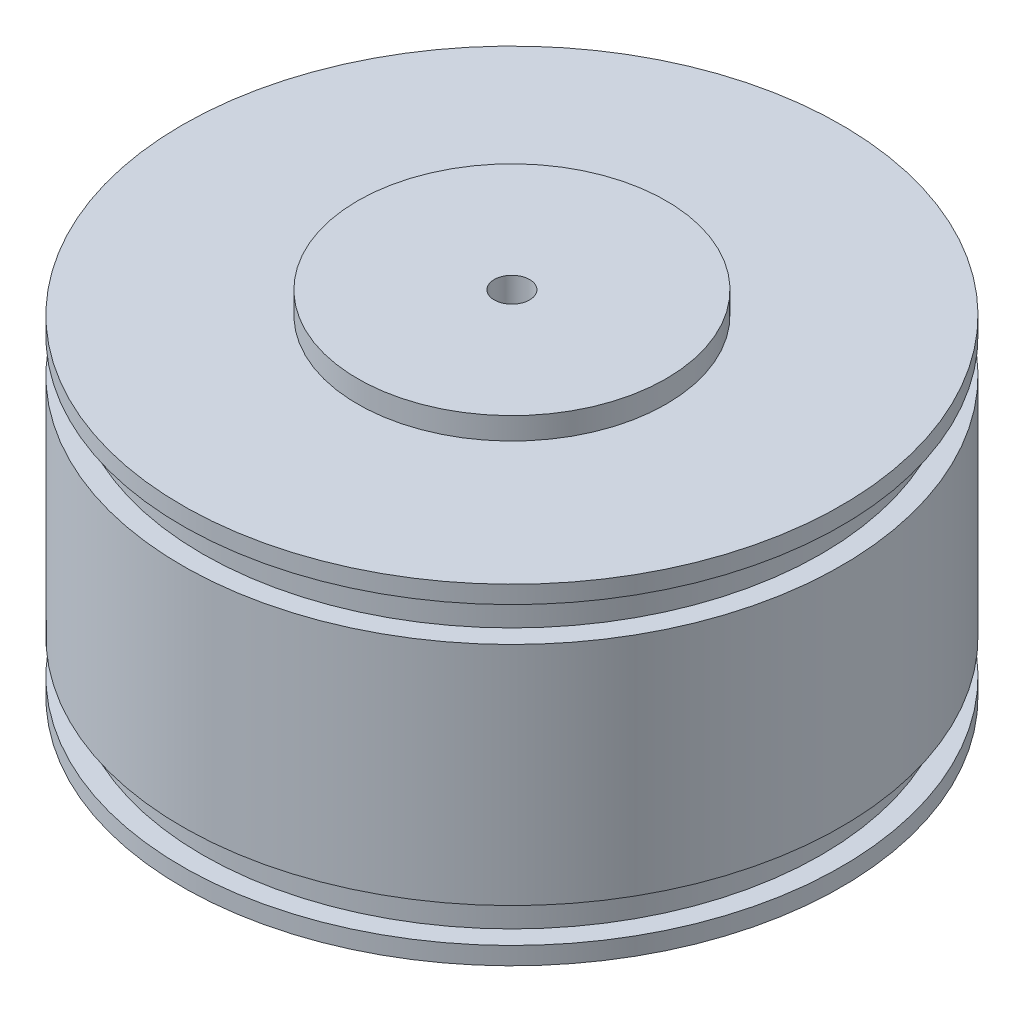
ISO-10303-21;
HEADER;
FILE_DESCRIPTION(('STEP AP214'),'2;1');
FILE_NAME('part.step','',(''),(''),'','','');
FILE_SCHEMA(('AUTOMOTIVE_DESIGN { 1 0 10303 214 1 1 1 1 }'));
ENDSEC;
DATA;
#1=APPLICATION_CONTEXT('core data for automotive mechanical design processes');
#2=APPLICATION_PROTOCOL_DEFINITION('international standard','automotive_design',2000,#1);
#3=PRODUCT_CONTEXT('',#1,'mechanical');
#4=PRODUCT('Part','Part','',(#3));
#5=PRODUCT_RELATED_PRODUCT_CATEGORY('part','',(#4));
#6=PRODUCT_DEFINITION_FORMATION('','',#4);
#7=PRODUCT_DEFINITION_CONTEXT('part definition',#1,'design');
#8=PRODUCT_DEFINITION('design','',#6,#7);
#9=PRODUCT_DEFINITION_SHAPE('','',#8);
#10=(LENGTH_UNIT() NAMED_UNIT(*) SI_UNIT(.MILLI.,.METRE.));
#11=(NAMED_UNIT(*) PLANE_ANGLE_UNIT() SI_UNIT($,.RADIAN.));
#12=(NAMED_UNIT(*) SI_UNIT($,.STERADIAN.) SOLID_ANGLE_UNIT());
#13=UNCERTAINTY_MEASURE_WITH_UNIT(LENGTH_MEASURE(1.E-05),#10,'distance_accuracy_value','');
#14=(GEOMETRIC_REPRESENTATION_CONTEXT(3) GLOBAL_UNCERTAINTY_ASSIGNED_CONTEXT((#13)) GLOBAL_UNIT_ASSIGNED_CONTEXT((#10,
#11,#12)) REPRESENTATION_CONTEXT('',''));
#15=CARTESIAN_POINT('',(0.,0.,0.));
#16=DIRECTION('',(0.,0.,1.));
#17=DIRECTION('',(1.,0.,0.));
#18=AXIS2_PLACEMENT_3D('',#15,#16,#17);
#19=CARTESIAN_POINT('',(0.,0.,0.));
#20=DIRECTION('',(0.,-1.,0.));
#21=DIRECTION('',(1.,0.,0.));
#22=AXIS2_PLACEMENT_3D('',#19,#20,#21);
#23=PLANE('',#22);
#24=CARTESIAN_POINT('',(0.,0.,0.));
#25=DIRECTION('',(0.,1.,0.));
#26=DIRECTION('',(0.,0.,1.));
#27=AXIS2_PLACEMENT_3D('',#24,#25,#26);
#28=CIRCLE('',#27,2.5527);
#29=CARTESIAN_POINT('',(0.,0.,2.5527));
#30=VERTEX_POINT('',#29);
#31=EDGE_CURVE('E65',#30,#30,#28,.T.);
#32=ORIENTED_EDGE('',*,*,#31,.F.);
#33=EDGE_LOOP('',(#32));
#34=FACE_BOUND('',#33,.T.);
#35=CARTESIAN_POINT('',(0.,0.,0.));
#36=DIRECTION('',(0.,1.,0.));
#37=DIRECTION('',(-1.,0.,0.));
#38=AXIS2_PLACEMENT_3D('',#35,#36,#37);
#39=CIRCLE('',#38,22.225);
#40=CARTESIAN_POINT('',(-22.225,0.,0.));
#41=VERTEX_POINT('',#40);
#42=EDGE_CURVE('E11',#41,#41,#39,.T.);
#43=ORIENTED_EDGE('',*,*,#42,.T.);
#44=EDGE_LOOP('',(#43));
#45=FACE_BOUND('',#44,.T.);
#46=ADVANCED_FACE('F45',(#34,#45),#23,.F.);
#47=CARTESIAN_POINT('',(0.,38.9010802269561,0.));
#48=DIRECTION('',(0.,1.,0.));
#49=DIRECTION('',(-1.,0.,0.));
#50=AXIS2_PLACEMENT_3D('',#47,#48,#49);
#51=CYLINDRICAL_SURFACE('',#50,22.225);
#52=ORIENTED_EDGE('',*,*,#42,.F.);
#53=EDGE_LOOP('',(#52));
#54=FACE_BOUND('',#53,.T.);
#55=CARTESIAN_POINT('',(0.,-3.175,0.));
#56=DIRECTION('',(0.,1.,0.));
#57=DIRECTION('',(-1.,0.,0.));
#58=AXIS2_PLACEMENT_3D('',#55,#56,#57);
#59=CIRCLE('',#58,22.225);
#60=CARTESIAN_POINT('',(-22.225,-3.175,0.));
#61=VERTEX_POINT('',#60);
#62=EDGE_CURVE('E51',#61,#61,#59,.T.);
#63=ORIENTED_EDGE('',*,*,#62,.T.);
#64=EDGE_LOOP('',(#63));
#65=FACE_BOUND('',#64,.T.);
#66=ADVANCED_FACE('F107',(#54,#65),#51,.T.);
#67=CARTESIAN_POINT('',(47.498,-3.175,0.));
#68=DIRECTION('',(0.,-1.,0.));
#69=DIRECTION('',(1.,0.,0.));
#70=AXIS2_PLACEMENT_3D('',#67,#68,#69);
#71=PLANE('',#70);
#72=ORIENTED_EDGE('',*,*,#62,.F.);
#73=EDGE_LOOP('',(#72));
#74=FACE_BOUND('',#73,.T.);
#75=CARTESIAN_POINT('',(0.,-3.175,0.));
#76=DIRECTION('',(0.,1.,0.));
#77=DIRECTION('',(-1.,0.,0.));
#78=AXIS2_PLACEMENT_3D('',#75,#76,#77);
#79=CIRCLE('',#78,47.498);
#80=CARTESIAN_POINT('',(-47.498,-3.17500000000001,0.));
#81=VERTEX_POINT('',#80);
#82=EDGE_CURVE('E102',#81,#81,#79,.T.);
#83=ORIENTED_EDGE('',*,*,#82,.T.);
#84=EDGE_LOOP('',(#83));
#85=FACE_BOUND('',#84,.T.);
#86=ADVANCED_FACE('F109',(#74,#85),#71,.F.);
#87=CARTESIAN_POINT('',(0.,38.9010802269561,0.));
#88=DIRECTION('',(0.,1.,0.));
#89=DIRECTION('',(-1.,0.,0.));
#90=AXIS2_PLACEMENT_3D('',#87,#88,#89);
#91=CYLINDRICAL_SURFACE('',#90,47.498);
#92=ORIENTED_EDGE('',*,*,#82,.F.);
#93=EDGE_LOOP('',(#92));
#94=FACE_BOUND('',#93,.T.);
#95=CARTESIAN_POINT('',(0.,-5.71500000000001,0.));
#96=DIRECTION('',(0.,1.,0.));
#97=DIRECTION('',(-1.,0.,0.));
#98=AXIS2_PLACEMENT_3D('',#95,#96,#97);
#99=CIRCLE('',#98,47.498);
#100=CARTESIAN_POINT('',(-47.498,-5.71500000000001,0.));
#101=VERTEX_POINT('',#100);
#102=EDGE_CURVE('E99',#101,#101,#99,.T.);
#103=ORIENTED_EDGE('',*,*,#102,.T.);
#104=EDGE_LOOP('',(#103));
#105=FACE_BOUND('',#104,.T.);
#106=ADVANCED_FACE('F112',(#94,#105),#91,.T.);
#107=CARTESIAN_POINT('',(47.498,-5.715,0.));
#108=DIRECTION('',(0.,1.,0.));
#109=DIRECTION('',(-1.,0.,0.));
#110=AXIS2_PLACEMENT_3D('',#107,#108,#109);
#111=PLANE('',#110);
#112=ORIENTED_EDGE('',*,*,#102,.F.);
#113=EDGE_LOOP('',(#112));
#114=FACE_BOUND('',#113,.T.);
#115=CARTESIAN_POINT('',(0.,-5.71500000000001,0.));
#116=DIRECTION('',(0.,1.,0.));
#117=DIRECTION('',(-1.,0.,0.));
#118=AXIS2_PLACEMENT_3D('',#115,#116,#117);
#119=CIRCLE('',#118,44.577);
#120=CARTESIAN_POINT('',(-44.577,-5.71500000000001,0.));
#121=VERTEX_POINT('',#120);
#122=EDGE_CURVE('E96',#121,#121,#119,.T.);
#123=ORIENTED_EDGE('',*,*,#122,.T.);
#124=EDGE_LOOP('',(#123));
#125=FACE_BOUND('',#124,.T.);
#126=ADVANCED_FACE('F118',(#114,#125),#111,.F.);
#127=CARTESIAN_POINT('',(0.,38.9010802269561,0.));
#128=DIRECTION('',(0.,1.,0.));
#129=DIRECTION('',(-1.,0.,0.));
#130=AXIS2_PLACEMENT_3D('',#127,#128,#129);
#131=CYLINDRICAL_SURFACE('',#130,44.577);
#132=ORIENTED_EDGE('',*,*,#122,.F.);
#133=EDGE_LOOP('',(#132));
#134=FACE_BOUND('',#133,.T.);
#135=CARTESIAN_POINT('',(0.,-10.6934,0.));
#136=DIRECTION('',(0.,1.,0.));
#137=DIRECTION('',(-1.,0.,0.));
#138=AXIS2_PLACEMENT_3D('',#135,#136,#137);
#139=CIRCLE('',#138,44.577);
#140=CARTESIAN_POINT('',(-44.577,-10.6934,0.));
#141=VERTEX_POINT('',#140);
#142=EDGE_CURVE('E93',#141,#141,#139,.T.);
#143=ORIENTED_EDGE('',*,*,#142,.T.);
#144=EDGE_LOOP('',(#143));
#145=FACE_BOUND('',#144,.T.);
#146=ADVANCED_FACE('F124',(#134,#145),#131,.T.);
#147=CARTESIAN_POINT('',(47.498,-10.6934,0.));
#148=DIRECTION('',(0.,-1.,0.));
#149=DIRECTION('',(1.,0.,0.));
#150=AXIS2_PLACEMENT_3D('',#147,#148,#149);
#151=PLANE('',#150);
#152=ORIENTED_EDGE('',*,*,#142,.F.);
#153=EDGE_LOOP('',(#152));
#154=FACE_BOUND('',#153,.T.);
#155=CARTESIAN_POINT('',(0.,-10.6934,0.));
#156=DIRECTION('',(0.,1.,0.));
#157=DIRECTION('',(-1.,0.,0.));
#158=AXIS2_PLACEMENT_3D('',#155,#156,#157);
#159=CIRCLE('',#158,47.498);
#160=CARTESIAN_POINT('',(-47.498,-10.6934,0.));
#161=VERTEX_POINT('',#160);
#162=EDGE_CURVE('E90',#161,#161,#159,.T.);
#163=ORIENTED_EDGE('',*,*,#162,.T.);
#164=EDGE_LOOP('',(#163));
#165=FACE_BOUND('',#164,.T.);
#166=ADVANCED_FACE('F130',(#154,#165),#151,.F.);
#167=CARTESIAN_POINT('',(0.,38.9010802269561,0.));
#168=DIRECTION('',(0.,1.,0.));
#169=DIRECTION('',(-1.,0.,0.));
#170=AXIS2_PLACEMENT_3D('',#167,#168,#169);
#171=CYLINDRICAL_SURFACE('',#170,47.498);
#172=ORIENTED_EDGE('',*,*,#162,.F.);
#173=EDGE_LOOP('',(#172));
#174=FACE_BOUND('',#173,.T.);
#175=CARTESIAN_POINT('',(0.,-43.2816,0.));
#176=DIRECTION('',(0.,1.,0.));
#177=DIRECTION('',(-1.,0.,0.));
#178=AXIS2_PLACEMENT_3D('',#175,#176,#177);
#179=CIRCLE('',#178,47.498);
#180=CARTESIAN_POINT('',(-47.498,-43.2816,0.));
#181=VERTEX_POINT('',#180);
#182=EDGE_CURVE('E87',#181,#181,#179,.T.);
#183=ORIENTED_EDGE('',*,*,#182,.T.);
#184=EDGE_LOOP('',(#183));
#185=FACE_BOUND('',#184,.T.);
#186=ADVANCED_FACE('F136',(#174,#185),#171,.T.);
#187=CARTESIAN_POINT('',(47.498,-43.2816,0.));
#188=DIRECTION('',(0.,1.,0.));
#189=DIRECTION('',(-1.,0.,0.));
#190=AXIS2_PLACEMENT_3D('',#187,#188,#189);
#191=PLANE('',#190);
#192=ORIENTED_EDGE('',*,*,#182,.F.);
#193=EDGE_LOOP('',(#192));
#194=FACE_BOUND('',#193,.T.);
#195=CARTESIAN_POINT('',(0.,-43.2816,0.));
#196=DIRECTION('',(0.,1.,0.));
#197=DIRECTION('',(-1.,0.,0.));
#198=AXIS2_PLACEMENT_3D('',#195,#196,#197);
#199=CIRCLE('',#198,44.577);
#200=CARTESIAN_POINT('',(-44.577,-43.2816,0.));
#201=VERTEX_POINT('',#200);
#202=EDGE_CURVE('E84',#201,#201,#199,.T.);
#203=ORIENTED_EDGE('',*,*,#202,.T.);
#204=EDGE_LOOP('',(#203));
#205=FACE_BOUND('',#204,.T.);
#206=ADVANCED_FACE('F142',(#194,#205),#191,.F.);
#207=CARTESIAN_POINT('',(0.,38.9010802269561,0.));
#208=DIRECTION('',(0.,1.,0.));
#209=DIRECTION('',(-1.,0.,0.));
#210=AXIS2_PLACEMENT_3D('',#207,#208,#209);
#211=CYLINDRICAL_SURFACE('',#210,44.577);
#212=ORIENTED_EDGE('',*,*,#202,.F.);
#213=EDGE_LOOP('',(#212));
#214=FACE_BOUND('',#213,.T.);
#215=CARTESIAN_POINT('',(0.,-48.26,0.));
#216=DIRECTION('',(0.,1.,0.));
#217=DIRECTION('',(-1.,0.,0.));
#218=AXIS2_PLACEMENT_3D('',#215,#216,#217);
#219=CIRCLE('',#218,44.577);
#220=CARTESIAN_POINT('',(-44.577,-48.26,0.));
#221=VERTEX_POINT('',#220);
#222=EDGE_CURVE('E81',#221,#221,#219,.T.);
#223=ORIENTED_EDGE('',*,*,#222,.T.);
#224=EDGE_LOOP('',(#223));
#225=FACE_BOUND('',#224,.T.);
#226=ADVANCED_FACE('F148',(#214,#225),#211,.T.);
#227=CARTESIAN_POINT('',(47.498,-48.26,0.));
#228=DIRECTION('',(0.,-1.,0.));
#229=DIRECTION('',(1.,0.,0.));
#230=AXIS2_PLACEMENT_3D('',#227,#228,#229);
#231=PLANE('',#230);
#232=ORIENTED_EDGE('',*,*,#222,.F.);
#233=EDGE_LOOP('',(#232));
#234=FACE_BOUND('',#233,.T.);
#235=CARTESIAN_POINT('',(0.,-48.26,0.));
#236=DIRECTION('',(0.,1.,0.));
#237=DIRECTION('',(-1.,0.,0.));
#238=AXIS2_PLACEMENT_3D('',#235,#236,#237);
#239=CIRCLE('',#238,47.498);
#240=CARTESIAN_POINT('',(-47.498,-48.26,0.));
#241=VERTEX_POINT('',#240);
#242=EDGE_CURVE('E78',#241,#241,#239,.T.);
#243=ORIENTED_EDGE('',*,*,#242,.T.);
#244=EDGE_LOOP('',(#243));
#245=FACE_BOUND('',#244,.T.);
#246=ADVANCED_FACE('F154',(#234,#245),#231,.F.);
#247=CARTESIAN_POINT('',(0.,38.9010802269561,0.));
#248=DIRECTION('',(0.,1.,0.));
#249=DIRECTION('',(-1.,0.,0.));
#250=AXIS2_PLACEMENT_3D('',#247,#248,#249);
#251=CYLINDRICAL_SURFACE('',#250,47.498);
#252=ORIENTED_EDGE('',*,*,#242,.F.);
#253=EDGE_LOOP('',(#252));
#254=FACE_BOUND('',#253,.T.);
#255=CARTESIAN_POINT('',(0.,-50.8,0.));
#256=DIRECTION('',(0.,1.,0.));
#257=DIRECTION('',(-1.,0.,0.));
#258=AXIS2_PLACEMENT_3D('',#255,#256,#257);
#259=CIRCLE('',#258,47.498);
#260=CARTESIAN_POINT('',(-47.498,-50.8,0.));
#261=VERTEX_POINT('',#260);
#262=EDGE_CURVE('E75',#261,#261,#259,.T.);
#263=ORIENTED_EDGE('',*,*,#262,.T.);
#264=EDGE_LOOP('',(#263));
#265=FACE_BOUND('',#264,.T.);
#266=ADVANCED_FACE('F160',(#254,#265),#251,.T.);
#267=CARTESIAN_POINT('',(47.498,-50.8,0.));
#268=DIRECTION('',(0.,1.,0.));
#269=DIRECTION('',(-1.,0.,0.));
#270=AXIS2_PLACEMENT_3D('',#267,#268,#269);
#271=PLANE('',#270);
#272=ORIENTED_EDGE('',*,*,#262,.F.);
#273=EDGE_LOOP('',(#272));
#274=FACE_BOUND('',#273,.T.);
#275=CARTESIAN_POINT('',(0.,-50.8,0.));
#276=DIRECTION('',(0.,1.,0.));
#277=DIRECTION('',(-1.,0.,0.));
#278=AXIS2_PLACEMENT_3D('',#275,#276,#277);
#279=CIRCLE('',#278,41.148);
#280=CARTESIAN_POINT('',(-41.148,-50.8,0.));
#281=VERTEX_POINT('',#280);
#282=EDGE_CURVE('E68',#281,#281,#279,.T.);
#283=ORIENTED_EDGE('',*,*,#282,.T.);
#284=EDGE_LOOP('',(#283));
#285=FACE_BOUND('',#284,.T.);
#286=ADVANCED_FACE('F166',(#274,#285),#271,.F.);
#287=CARTESIAN_POINT('',(0.,38.9010802269561,0.));
#288=DIRECTION('',(0.,1.,0.));
#289=DIRECTION('',(-1.,0.,0.));
#290=AXIS2_PLACEMENT_3D('',#287,#288,#289);
#291=CYLINDRICAL_SURFACE('',#290,41.148);
#292=ORIENTED_EDGE('',*,*,#282,.F.);
#293=EDGE_LOOP('',(#292));
#294=FACE_BOUND('',#293,.T.);
#295=CARTESIAN_POINT('',(0.,-12.7,0.));
#296=DIRECTION('',(0.,1.,0.));
#297=DIRECTION('',(-1.,0.,0.));
#298=AXIS2_PLACEMENT_3D('',#295,#296,#297);
#299=CIRCLE('',#298,41.148);
#300=CARTESIAN_POINT('',(-41.148,-12.7,0.));
#301=VERTEX_POINT('',#300);
#302=EDGE_CURVE('E64',#301,#301,#299,.T.);
#303=ORIENTED_EDGE('',*,*,#302,.T.);
#304=EDGE_LOOP('',(#303));
#305=FACE_BOUND('',#304,.T.);
#306=ADVANCED_FACE('F172',(#294,#305),#291,.F.);
#307=CARTESIAN_POINT('',(41.148,-12.7,0.));
#308=DIRECTION('',(0.,1.,0.));
#309=DIRECTION('',(-1.,0.,0.));
#310=AXIS2_PLACEMENT_3D('',#307,#308,#309);
#311=PLANE('',#310);
#312=ORIENTED_EDGE('',*,*,#302,.F.);
#313=EDGE_LOOP('',(#312));
#314=FACE_BOUND('',#313,.T.);
#315=ADVANCED_FACE('F58',(#314),#311,.F.);
#316=CARTESIAN_POINT('',(0.,-8.11818309780835,0.));
#317=DIRECTION('',(0.,1.,0.));
#318=DIRECTION('',(0.,0.,1.));
#319=AXIS2_PLACEMENT_3D('',#316,#317,#318);
#320=CONICAL_SURFACE('',#319,2.5527,1.02974425867665);
#321=CARTESIAN_POINT('',(0.,-9.652,0.));
#322=VERTEX_POINT('',#321);
#323=VERTEX_LOOP('',#322);
#324=FACE_BOUND('',#323,.T.);
#325=CARTESIAN_POINT('',(0.,-8.11818309780835,0.));
#326=DIRECTION('',(0.,1.,0.));
#327=DIRECTION('',(0.,0.,1.));
#328=AXIS2_PLACEMENT_3D('',#325,#326,#327);
#329=CIRCLE('',#328,2.5527);
#330=CARTESIAN_POINT('',(0.,-8.11818309780835,2.5527));
#331=VERTEX_POINT('',#330);
#332=EDGE_CURVE('E62',#331,#331,#329,.T.);
#333=ORIENTED_EDGE('',*,*,#332,.T.);
#334=EDGE_LOOP('',(#333));
#335=FACE_BOUND('',#334,.T.);
#336=ADVANCED_FACE('F54',(#324,#335),#320,.F.);
#337=CARTESIAN_POINT('',(0.,0.,0.));
#338=DIRECTION('',(0.,1.,0.));
#339=DIRECTION('',(0.,0.,1.));
#340=AXIS2_PLACEMENT_3D('',#337,#338,#339);
#341=CYLINDRICAL_SURFACE('',#340,2.5527);
#342=ORIENTED_EDGE('',*,*,#332,.F.);
#343=EDGE_LOOP('',(#342));
#344=FACE_BOUND('',#343,.T.);
#345=ORIENTED_EDGE('',*,*,#31,.T.);
#346=EDGE_LOOP('',(#345));
#347=FACE_BOUND('',#346,.T.);
#348=ADVANCED_FACE('F57',(#344,#347),#341,.F.);
#349=CLOSED_SHELL('',(#46,#66,#86,#106,#126,#146,#166,#186,#206,#226,#246,#266,#286,#306,#315,
#336,#348));
#350=MANIFOLD_SOLID_BREP('B2',#349);
#351=ADVANCED_BREP_SHAPE_REPRESENTATION('',(#18,#350),#14);
#352=SHAPE_DEFINITION_REPRESENTATION(#9,#351);
ENDSEC;
END-ISO-10303-21;
